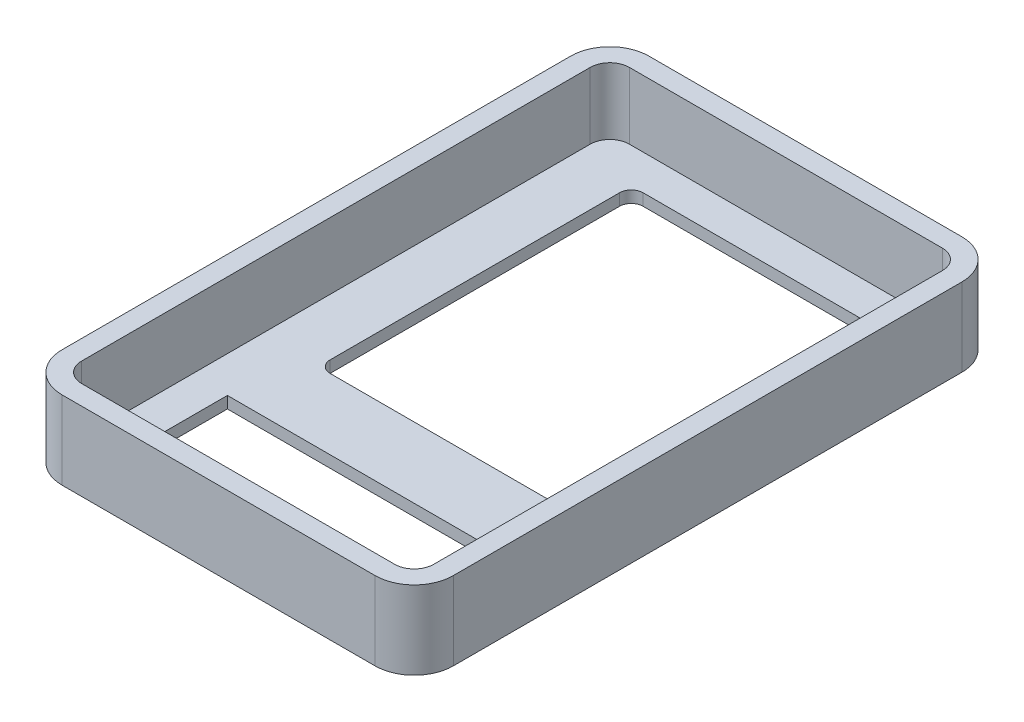
ISO-10303-21;
HEADER;
FILE_DESCRIPTION(('STEP AP214'),'2;1');
FILE_NAME('part.step','',(''),(''),'','','');
FILE_SCHEMA(('AUTOMOTIVE_DESIGN { 1 0 10303 214 1 1 1 1 }'));
ENDSEC;
DATA;
#1=APPLICATION_CONTEXT('core data for automotive mechanical design processes');
#2=APPLICATION_PROTOCOL_DEFINITION('international standard','automotive_design',2000,#1);
#3=PRODUCT_CONTEXT('',#1,'mechanical');
#4=PRODUCT('Part','Part','',(#3));
#5=PRODUCT_RELATED_PRODUCT_CATEGORY('part','',(#4));
#6=PRODUCT_DEFINITION_FORMATION('','',#4);
#7=PRODUCT_DEFINITION_CONTEXT('part definition',#1,'design');
#8=PRODUCT_DEFINITION('design','',#6,#7);
#9=PRODUCT_DEFINITION_SHAPE('','',#8);
#10=(LENGTH_UNIT() NAMED_UNIT(*) SI_UNIT(.MILLI.,.METRE.));
#11=(NAMED_UNIT(*) PLANE_ANGLE_UNIT() SI_UNIT($,.RADIAN.));
#12=(NAMED_UNIT(*) SI_UNIT($,.STERADIAN.) SOLID_ANGLE_UNIT());
#13=UNCERTAINTY_MEASURE_WITH_UNIT(LENGTH_MEASURE(1.E-05),#10,'distance_accuracy_value','');
#14=(GEOMETRIC_REPRESENTATION_CONTEXT(3) GLOBAL_UNCERTAINTY_ASSIGNED_CONTEXT((#13)) GLOBAL_UNIT_ASSIGNED_CONTEXT((#10,
#11,#12)) REPRESENTATION_CONTEXT('',''));
#15=CARTESIAN_POINT('',(0.,0.,0.));
#16=DIRECTION('',(0.,0.,1.));
#17=DIRECTION('',(1.,0.,0.));
#18=AXIS2_PLACEMENT_3D('',#15,#16,#17);
#19=CARTESIAN_POINT('',(-39.9999999999999,20.,-75.));
#20=DIRECTION('',(0.,0.,-1.));
#21=DIRECTION('',(-1.,0.,0.));
#22=AXIS2_PLACEMENT_3D('',#19,#20,#21);
#23=PLANE('',#22);
#24=DIRECTION('',(1.,0.,0.));
#25=VECTOR('',#24,1.);
#26=CARTESIAN_POINT('',(-39.9999999999999,0.,-75.));
#27=LINE('',#26,#25);
#28=CARTESIAN_POINT('',(-40.,0.,-75.));
#29=VERTEX_POINT('',#28);
#30=CARTESIAN_POINT('',(39.9999999999999,0.,-75.));
#31=VERTEX_POINT('',#30);
#32=EDGE_CURVE('E391',#29,#31,#27,.T.);
#33=ORIENTED_EDGE('',*,*,#32,.F.);
#34=DIRECTION('',(0.,-1.,0.));
#35=VECTOR('',#34,1.);
#36=CARTESIAN_POINT('',(-40.,20.,-75.));
#37=LINE('',#36,#35);
#38=CARTESIAN_POINT('',(-40.,20.,-75.));
#39=VERTEX_POINT('',#38);
#40=EDGE_CURVE('E471',#39,#29,#37,.T.);
#41=ORIENTED_EDGE('',*,*,#40,.F.);
#42=DIRECTION('',(1.,0.,0.));
#43=VECTOR('',#42,1.);
#44=CARTESIAN_POINT('',(-39.9999999999999,20.,-75.));
#45=LINE('',#44,#43);
#46=CARTESIAN_POINT('',(39.9999999999999,20.,-75.));
#47=VERTEX_POINT('',#46);
#48=EDGE_CURVE('E413',#39,#47,#45,.T.);
#49=ORIENTED_EDGE('',*,*,#48,.T.);
#50=DIRECTION('',(0.,-1.,0.));
#51=VECTOR('',#50,1.);
#52=CARTESIAN_POINT('',(39.9999999999999,20.,-75.));
#53=LINE('',#52,#51);
#54=EDGE_CURVE('E442',#47,#31,#53,.T.);
#55=ORIENTED_EDGE('',*,*,#54,.T.);
#56=EDGE_LOOP('',(#33,#41,#49,#55));
#57=FACE_BOUND('',#56,.T.);
#58=ADVANCED_FACE('F45',(#57),#23,.T.);
#59=CARTESIAN_POINT('',(-40.,20.,-65.));
#60=DIRECTION('',(0.,-1.,0.));
#61=DIRECTION('',(0.,0.,-1.));
#62=AXIS2_PLACEMENT_3D('',#59,#60,#61);
#63=CYLINDRICAL_SURFACE('',#62,9.99999999999999);
#64=CARTESIAN_POINT('',(-40.,0.,-65.));
#65=DIRECTION('',(0.,-1.,0.));
#66=DIRECTION('',(0.,0.,-1.));
#67=AXIS2_PLACEMENT_3D('',#64,#65,#66);
#68=CIRCLE('',#67,9.99999999999999);
#69=CARTESIAN_POINT('',(-50.,0.,-64.9999999999999));
#70=VERTEX_POINT('',#69);
#71=EDGE_CURVE('E418',#70,#29,#68,.T.);
#72=ORIENTED_EDGE('',*,*,#71,.F.);
#73=DIRECTION('',(0.,-1.,0.));
#74=VECTOR('',#73,1.);
#75=CARTESIAN_POINT('',(-50.,20.,-64.9999999999999));
#76=LINE('',#75,#74);
#77=CARTESIAN_POINT('',(-50.,20.,-64.9999999999999));
#78=VERTEX_POINT('',#77);
#79=EDGE_CURVE('E475',#78,#70,#76,.T.);
#80=ORIENTED_EDGE('',*,*,#79,.F.);
#81=CARTESIAN_POINT('',(-40.,20.,-65.));
#82=DIRECTION('',(0.,-1.,0.));
#83=DIRECTION('',(0.,0.,-1.));
#84=AXIS2_PLACEMENT_3D('',#81,#82,#83);
#85=CIRCLE('',#84,9.99999999999999);
#86=EDGE_CURVE('E438',#78,#39,#85,.T.);
#87=ORIENTED_EDGE('',*,*,#86,.T.);
#88=ORIENTED_EDGE('',*,*,#40,.T.);
#89=EDGE_LOOP('',(#72,#80,#87,#88));
#90=FACE_BOUND('',#89,.T.);
#91=ADVANCED_FACE('F569',(#90),#63,.T.);
#92=CARTESIAN_POINT('',(-50.,20.,64.9999999999999));
#93=DIRECTION('',(-1.,0.,0.));
#94=DIRECTION('',(0.,0.,1.));
#95=AXIS2_PLACEMENT_3D('',#92,#93,#94);
#96=PLANE('',#95);
#97=DIRECTION('',(0.,0.,-1.));
#98=VECTOR('',#97,1.);
#99=CARTESIAN_POINT('',(-50.,0.,64.9999999999999));
#100=LINE('',#99,#98);
#101=CARTESIAN_POINT('',(-50.,0.,64.9999999999999));
#102=VERTEX_POINT('',#101);
#103=EDGE_CURVE('E464',#102,#70,#100,.T.);
#104=ORIENTED_EDGE('',*,*,#103,.F.);
#105=DIRECTION('',(0.,-1.,0.));
#106=VECTOR('',#105,1.);
#107=CARTESIAN_POINT('',(-50.,20.,64.9999999999999));
#108=LINE('',#107,#106);
#109=CARTESIAN_POINT('',(-50.,20.,64.9999999999999));
#110=VERTEX_POINT('',#109);
#111=EDGE_CURVE('E478',#110,#102,#108,.T.);
#112=ORIENTED_EDGE('',*,*,#111,.F.);
#113=DIRECTION('',(0.,0.,-1.));
#114=VECTOR('',#113,1.);
#115=CARTESIAN_POINT('',(-50.,20.,64.9999999999999));
#116=LINE('',#115,#114);
#117=EDGE_CURVE('E434',#110,#78,#116,.T.);
#118=ORIENTED_EDGE('',*,*,#117,.T.);
#119=ORIENTED_EDGE('',*,*,#79,.T.);
#120=EDGE_LOOP('',(#104,#112,#118,#119));
#121=FACE_BOUND('',#120,.T.);
#122=ADVANCED_FACE('F574',(#121),#96,.T.);
#123=CARTESIAN_POINT('',(-40.,20.,65.));
#124=DIRECTION('',(0.,-1.,0.));
#125=DIRECTION('',(0.,0.,-1.));
#126=AXIS2_PLACEMENT_3D('',#123,#124,#125);
#127=CYLINDRICAL_SURFACE('',#126,9.99999999999999);
#128=CARTESIAN_POINT('',(-40.,0.,65.));
#129=DIRECTION('',(0.,1.,0.));
#130=DIRECTION('',(0.,0.,1.));
#131=AXIS2_PLACEMENT_3D('',#128,#129,#130);
#132=CIRCLE('',#131,9.99999999999999);
#133=CARTESIAN_POINT('',(-40.,0.,75.));
#134=VERTEX_POINT('',#133);
#135=EDGE_CURVE('E461',#102,#134,#132,.T.);
#136=ORIENTED_EDGE('',*,*,#135,.T.);
#137=DIRECTION('',(0.,-1.,0.));
#138=VECTOR('',#137,1.);
#139=CARTESIAN_POINT('',(-40.,20.,75.));
#140=LINE('',#139,#138);
#141=CARTESIAN_POINT('',(-40.,20.,75.));
#142=VERTEX_POINT('',#141);
#143=EDGE_CURVE('E481',#142,#134,#140,.T.);
#144=ORIENTED_EDGE('',*,*,#143,.F.);
#145=CARTESIAN_POINT('',(-40.,20.,65.));
#146=DIRECTION('',(0.,1.,0.));
#147=DIRECTION('',(0.,0.,1.));
#148=AXIS2_PLACEMENT_3D('',#145,#146,#147);
#149=CIRCLE('',#148,9.99999999999999);
#150=EDGE_CURVE('E431',#110,#142,#149,.T.);
#151=ORIENTED_EDGE('',*,*,#150,.F.);
#152=ORIENTED_EDGE('',*,*,#111,.T.);
#153=EDGE_LOOP('',(#136,#144,#151,#152));
#154=FACE_BOUND('',#153,.T.);
#155=ADVANCED_FACE('F609',(#154),#127,.T.);
#156=CARTESIAN_POINT('',(-39.9999999999999,20.,75.));
#157=DIRECTION('',(0.,0.,-1.));
#158=DIRECTION('',(-1.,0.,0.));
#159=AXIS2_PLACEMENT_3D('',#156,#157,#158);
#160=PLANE('',#159);
#161=DIRECTION('',(1.,0.,0.));
#162=VECTOR('',#161,1.);
#163=CARTESIAN_POINT('',(-39.9999999999999,0.,75.));
#164=LINE('',#163,#162);
#165=CARTESIAN_POINT('',(39.9999999999999,0.,75.));
#166=VERTEX_POINT('',#165);
#167=EDGE_CURVE('E457',#134,#166,#164,.T.);
#168=ORIENTED_EDGE('',*,*,#167,.T.);
#169=DIRECTION('',(0.,-1.,0.));
#170=VECTOR('',#169,1.);
#171=CARTESIAN_POINT('',(39.9999999999999,20.,75.));
#172=LINE('',#171,#170);
#173=CARTESIAN_POINT('',(39.9999999999999,20.,75.));
#174=VERTEX_POINT('',#173);
#175=EDGE_CURVE('E485',#174,#166,#172,.T.);
#176=ORIENTED_EDGE('',*,*,#175,.F.);
#177=DIRECTION('',(1.,0.,0.));
#178=VECTOR('',#177,1.);
#179=CARTESIAN_POINT('',(-39.9999999999999,20.,75.));
#180=LINE('',#179,#178);
#181=EDGE_CURVE('E428',#142,#174,#180,.T.);
#182=ORIENTED_EDGE('',*,*,#181,.F.);
#183=ORIENTED_EDGE('',*,*,#143,.T.);
#184=EDGE_LOOP('',(#168,#176,#182,#183));
#185=FACE_BOUND('',#184,.T.);
#186=ADVANCED_FACE('F604',(#185),#160,.F.);
#187=CARTESIAN_POINT('',(40.,20.,65.));
#188=DIRECTION('',(0.,-1.,0.));
#189=DIRECTION('',(0.,0.,-1.));
#190=AXIS2_PLACEMENT_3D('',#187,#188,#189);
#191=CYLINDRICAL_SURFACE('',#190,9.99999999999999);
#192=CARTESIAN_POINT('',(40.,0.,65.));
#193=DIRECTION('',(0.,-1.,0.));
#194=DIRECTION('',(0.,0.,-1.));
#195=AXIS2_PLACEMENT_3D('',#192,#193,#194);
#196=CIRCLE('',#195,9.99999999999999);
#197=CARTESIAN_POINT('',(50.,0.,64.9999999999999));
#198=VERTEX_POINT('',#197);
#199=EDGE_CURVE('E453',#198,#166,#196,.T.);
#200=ORIENTED_EDGE('',*,*,#199,.F.);
#201=DIRECTION('',(0.,-1.,0.));
#202=VECTOR('',#201,1.);
#203=CARTESIAN_POINT('',(50.,20.,64.9999999999999));
#204=LINE('',#203,#202);
#205=CARTESIAN_POINT('',(50.,20.,64.9999999999999));
#206=VERTEX_POINT('',#205);
#207=EDGE_CURVE('E488',#206,#198,#204,.T.);
#208=ORIENTED_EDGE('',*,*,#207,.F.);
#209=CARTESIAN_POINT('',(40.,20.,65.));
#210=DIRECTION('',(0.,-1.,0.));
#211=DIRECTION('',(0.,0.,-1.));
#212=AXIS2_PLACEMENT_3D('',#209,#210,#211);
#213=CIRCLE('',#212,9.99999999999999);
#214=EDGE_CURVE('E424',#206,#174,#213,.T.);
#215=ORIENTED_EDGE('',*,*,#214,.T.);
#216=ORIENTED_EDGE('',*,*,#175,.T.);
#217=EDGE_LOOP('',(#200,#208,#215,#216));
#218=FACE_BOUND('',#217,.T.);
#219=ADVANCED_FACE('F600',(#218),#191,.T.);
#220=CARTESIAN_POINT('',(50.,20.,64.9999999999999));
#221=DIRECTION('',(-1.,0.,0.));
#222=DIRECTION('',(0.,0.,1.));
#223=AXIS2_PLACEMENT_3D('',#220,#221,#222);
#224=PLANE('',#223);
#225=DIRECTION('',(0.,0.,-1.));
#226=VECTOR('',#225,1.);
#227=CARTESIAN_POINT('',(50.,0.,64.9999999999999));
#228=LINE('',#227,#226);
#229=CARTESIAN_POINT('',(50.,0.,-64.9999999999999));
#230=VERTEX_POINT('',#229);
#231=EDGE_CURVE('E450',#198,#230,#228,.T.);
#232=ORIENTED_EDGE('',*,*,#231,.T.);
#233=DIRECTION('',(0.,-1.,0.));
#234=VECTOR('',#233,1.);
#235=CARTESIAN_POINT('',(50.,20.,-64.9999999999999));
#236=LINE('',#235,#234);
#237=CARTESIAN_POINT('',(50.,20.,-64.9999999999999));
#238=VERTEX_POINT('',#237);
#239=EDGE_CURVE('E491',#238,#230,#236,.T.);
#240=ORIENTED_EDGE('',*,*,#239,.F.);
#241=DIRECTION('',(0.,0.,-1.));
#242=VECTOR('',#241,1.);
#243=CARTESIAN_POINT('',(50.,20.,64.9999999999999));
#244=LINE('',#243,#242);
#245=EDGE_CURVE('E421',#206,#238,#244,.T.);
#246=ORIENTED_EDGE('',*,*,#245,.F.);
#247=ORIENTED_EDGE('',*,*,#207,.T.);
#248=EDGE_LOOP('',(#232,#240,#246,#247));
#249=FACE_BOUND('',#248,.T.);
#250=ADVANCED_FACE('F621',(#249),#224,.F.);
#251=CARTESIAN_POINT('',(40.,20.,-65.));
#252=DIRECTION('',(0.,-1.,0.));
#253=DIRECTION('',(0.,0.,-1.));
#254=AXIS2_PLACEMENT_3D('',#251,#252,#253);
#255=CYLINDRICAL_SURFACE('',#254,9.99999999999999);
#256=CARTESIAN_POINT('',(40.,0.,-65.));
#257=DIRECTION('',(0.,1.,0.));
#258=DIRECTION('',(0.,0.,1.));
#259=AXIS2_PLACEMENT_3D('',#256,#257,#258);
#260=CIRCLE('',#259,9.99999999999999);
#261=EDGE_CURVE('E446',#230,#31,#260,.T.);
#262=ORIENTED_EDGE('',*,*,#261,.T.);
#263=ORIENTED_EDGE('',*,*,#54,.F.);
#264=CARTESIAN_POINT('',(40.,20.,-65.));
#265=DIRECTION('',(0.,1.,0.));
#266=DIRECTION('',(0.,0.,1.));
#267=AXIS2_PLACEMENT_3D('',#264,#265,#266);
#268=CIRCLE('',#267,9.99999999999999);
#269=EDGE_CURVE('E417',#238,#47,#268,.T.);
#270=ORIENTED_EDGE('',*,*,#269,.F.);
#271=ORIENTED_EDGE('',*,*,#239,.T.);
#272=EDGE_LOOP('',(#262,#263,#270,#271));
#273=FACE_BOUND('',#272,.T.);
#274=ADVANCED_FACE('F594',(#273),#255,.T.);
#275=CARTESIAN_POINT('',(40.,20.,-65.));
#276=DIRECTION('',(0.,1.,0.));
#277=DIRECTION('',(0.,0.,1.));
#278=AXIS2_PLACEMENT_3D('',#275,#276,#277);
#279=PLANE('',#278);
#280=CARTESIAN_POINT('',(40.,20.,-65.));
#281=DIRECTION('',(0.,1.,0.));
#282=DIRECTION('',(0.,0.,1.));
#283=AXIS2_PLACEMENT_3D('',#280,#281,#282);
#284=CIRCLE('',#283,4.99999999999999);
#285=CARTESIAN_POINT('',(45.,20.,-64.9999999999999));
#286=VERTEX_POINT('',#285);
#287=CARTESIAN_POINT('',(39.9999999999999,20.,-70.));
#288=VERTEX_POINT('',#287);
#289=EDGE_CURVE('E282',#286,#288,#284,.T.);
#290=ORIENTED_EDGE('',*,*,#289,.F.);
#291=DIRECTION('',(0.,0.,-1.));
#292=VECTOR('',#291,1.);
#293=CARTESIAN_POINT('',(45.,20.,65.));
#294=LINE('',#293,#292);
#295=CARTESIAN_POINT('',(45.,20.,65.));
#296=VERTEX_POINT('',#295);
#297=EDGE_CURVE('E330',#296,#286,#294,.T.);
#298=ORIENTED_EDGE('',*,*,#297,.F.);
#299=CARTESIAN_POINT('',(40.,20.,65.));
#300=DIRECTION('',(0.,1.,0.));
#301=DIRECTION('',(0.,0.,1.));
#302=AXIS2_PLACEMENT_3D('',#299,#300,#301);
#303=CIRCLE('',#302,4.99999999999999);
#304=CARTESIAN_POINT('',(39.9999999999999,20.,70.));
#305=VERTEX_POINT('',#304);
#306=EDGE_CURVE('E381',#305,#296,#303,.T.);
#307=ORIENTED_EDGE('',*,*,#306,.F.);
#308=DIRECTION('',(1.,0.,0.));
#309=VECTOR('',#308,1.);
#310=CARTESIAN_POINT('',(-40.,20.,70.));
#311=LINE('',#310,#309);
#312=CARTESIAN_POINT('',(-40.,20.,70.));
#313=VERTEX_POINT('',#312);
#314=EDGE_CURVE('E377',#313,#305,#311,.T.);
#315=ORIENTED_EDGE('',*,*,#314,.F.);
#316=CARTESIAN_POINT('',(-40.,20.,65.));
#317=DIRECTION('',(0.,1.,0.));
#318=DIRECTION('',(0.,0.,1.));
#319=AXIS2_PLACEMENT_3D('',#316,#317,#318);
#320=CIRCLE('',#319,4.99999999999999);
#321=CARTESIAN_POINT('',(-45.,20.,64.9999999999999));
#322=VERTEX_POINT('',#321);
#323=EDGE_CURVE('E373',#322,#313,#320,.T.);
#324=ORIENTED_EDGE('',*,*,#323,.F.);
#325=DIRECTION('',(0.,0.,1.));
#326=VECTOR('',#325,1.);
#327=CARTESIAN_POINT('',(-45.,20.,-64.9999999999999));
#328=LINE('',#327,#326);
#329=CARTESIAN_POINT('',(-45.,20.,-64.9999999999999));
#330=VERTEX_POINT('',#329);
#331=EDGE_CURVE('E369',#330,#322,#328,.T.);
#332=ORIENTED_EDGE('',*,*,#331,.F.);
#333=CARTESIAN_POINT('',(-40.,20.,-65.));
#334=DIRECTION('',(0.,1.,0.));
#335=DIRECTION('',(0.,0.,1.));
#336=AXIS2_PLACEMENT_3D('',#333,#334,#335);
#337=CIRCLE('',#336,4.99999999999999);
#338=CARTESIAN_POINT('',(-40.,20.,-70.));
#339=VERTEX_POINT('',#338);
#340=EDGE_CURVE('E365',#339,#330,#337,.T.);
#341=ORIENTED_EDGE('',*,*,#340,.F.);
#342=DIRECTION('',(-1.,0.,0.));
#343=VECTOR('',#342,1.);
#344=CARTESIAN_POINT('',(39.9999999999999,20.,-70.));
#345=LINE('',#344,#343);
#346=EDGE_CURVE('E361',#288,#339,#345,.T.);
#347=ORIENTED_EDGE('',*,*,#346,.F.);
#348=EDGE_LOOP('',(#290,#298,#307,#315,#324,#332,#341,#347));
#349=FACE_BOUND('',#348,.T.);
#350=ORIENTED_EDGE('',*,*,#48,.F.);
#351=ORIENTED_EDGE('',*,*,#86,.F.);
#352=ORIENTED_EDGE('',*,*,#117,.F.);
#353=ORIENTED_EDGE('',*,*,#150,.T.);
#354=ORIENTED_EDGE('',*,*,#181,.T.);
#355=ORIENTED_EDGE('',*,*,#214,.F.);
#356=ORIENTED_EDGE('',*,*,#245,.T.);
#357=ORIENTED_EDGE('',*,*,#269,.T.);
#358=EDGE_LOOP('',(#350,#351,#352,#353,#354,#355,#356,#357));
#359=FACE_BOUND('',#358,.T.);
#360=ADVANCED_FACE('F588',(#349,#359),#279,.T.);
#361=CARTESIAN_POINT('',(40.,0.,-65.));
#362=DIRECTION('',(0.,1.,0.));
#363=DIRECTION('',(0.,0.,1.));
#364=AXIS2_PLACEMENT_3D('',#361,#362,#363);
#365=PLANE('',#364);
#366=DIRECTION('',(-1.,0.,0.));
#367=VECTOR('',#366,1.);
#368=CARTESIAN_POINT('',(-27.5,0.,19.));
#369=LINE('',#368,#367);
#370=CARTESIAN_POINT('',(27.5,0.,19.));
#371=VERTEX_POINT('',#370);
#372=CARTESIAN_POINT('',(-27.5,0.,19.));
#373=VERTEX_POINT('',#372);
#374=EDGE_CURVE('E247',#371,#373,#369,.T.);
#375=ORIENTED_EDGE('',*,*,#374,.F.);
#376=CARTESIAN_POINT('',(27.5,0.,16.));
#377=DIRECTION('',(0.,-1.,0.));
#378=DIRECTION('',(0.,0.,1.));
#379=AXIS2_PLACEMENT_3D('',#376,#377,#378);
#380=CIRCLE('',#379,3.);
#381=CARTESIAN_POINT('',(30.5,0.,16.));
#382=VERTEX_POINT('',#381);
#383=EDGE_CURVE('E60',#382,#371,#380,.T.);
#384=ORIENTED_EDGE('',*,*,#383,.F.);
#385=DIRECTION('',(0.,0.,1.));
#386=VECTOR('',#385,1.);
#387=CARTESIAN_POINT('',(30.5,0.,-58.));
#388=LINE('',#387,#386);
#389=CARTESIAN_POINT('',(30.5,0.,-58.));
#390=VERTEX_POINT('',#389);
#391=EDGE_CURVE('E275',#390,#382,#388,.T.);
#392=ORIENTED_EDGE('',*,*,#391,.F.);
#393=CARTESIAN_POINT('',(27.5,0.,-58.));
#394=DIRECTION('',(0.,-1.,0.));
#395=DIRECTION('',(0.,0.,-1.));
#396=AXIS2_PLACEMENT_3D('',#393,#394,#395);
#397=CIRCLE('',#396,3.);
#398=CARTESIAN_POINT('',(27.5,0.,-61.));
#399=VERTEX_POINT('',#398);
#400=EDGE_CURVE('E271',#399,#390,#397,.T.);
#401=ORIENTED_EDGE('',*,*,#400,.F.);
#402=DIRECTION('',(1.,0.,0.));
#403=VECTOR('',#402,1.);
#404=CARTESIAN_POINT('',(-27.5,0.,-61.));
#405=LINE('',#404,#403);
#406=CARTESIAN_POINT('',(-27.5,0.,-61.));
#407=VERTEX_POINT('',#406);
#408=EDGE_CURVE('E267',#407,#399,#405,.T.);
#409=ORIENTED_EDGE('',*,*,#408,.F.);
#410=CARTESIAN_POINT('',(-27.5,0.,-58.));
#411=DIRECTION('',(0.,-1.,0.));
#412=DIRECTION('',(0.,0.,1.));
#413=AXIS2_PLACEMENT_3D('',#410,#411,#412);
#414=CIRCLE('',#413,3.);
#415=CARTESIAN_POINT('',(-30.5,0.,-58.));
#416=VERTEX_POINT('',#415);
#417=EDGE_CURVE('E260',#416,#407,#414,.T.);
#418=ORIENTED_EDGE('',*,*,#417,.F.);
#419=DIRECTION('',(0.,0.,-1.));
#420=VECTOR('',#419,1.);
#421=CARTESIAN_POINT('',(-30.5,0.,-58.));
#422=LINE('',#421,#420);
#423=CARTESIAN_POINT('',(-30.5,0.,16.));
#424=VERTEX_POINT('',#423);
#425=EDGE_CURVE('E256',#424,#416,#422,.T.);
#426=ORIENTED_EDGE('',*,*,#425,.F.);
#427=CARTESIAN_POINT('',(-27.5,0.,16.));
#428=DIRECTION('',(0.,-1.,0.));
#429=DIRECTION('',(0.,0.,1.));
#430=AXIS2_PLACEMENT_3D('',#427,#428,#429);
#431=CIRCLE('',#430,3.);
#432=EDGE_CURVE('E236',#373,#424,#431,.T.);
#433=ORIENTED_EDGE('',*,*,#432,.F.);
#434=EDGE_LOOP('',(#375,#384,#392,#401,#409,#418,#426,#433));
#435=FACE_BOUND('',#434,.T.);
#436=DIRECTION('',(1.,0.,0.));
#437=VECTOR('',#436,1.);
#438=CARTESIAN_POINT('',(-35.75,0.,37.));
#439=LINE('',#438,#437);
#440=CARTESIAN_POINT('',(-35.75,0.,37.));
#441=VERTEX_POINT('',#440);
#442=CARTESIAN_POINT('',(35.75,0.,37.));
#443=VERTEX_POINT('',#442);
#444=EDGE_CURVE('E319',#441,#443,#439,.T.);
#445=ORIENTED_EDGE('',*,*,#444,.F.);
#446=DIRECTION('',(0.,0.,-1.));
#447=VECTOR('',#446,1.);
#448=CARTESIAN_POINT('',(-35.75,0.,63.25));
#449=LINE('',#448,#447);
#450=CARTESIAN_POINT('',(-35.75,0.,63.25));
#451=VERTEX_POINT('',#450);
#452=EDGE_CURVE('E68',#451,#441,#449,.T.);
#453=ORIENTED_EDGE('',*,*,#452,.F.);
#454=DIRECTION('',(-1.,0.,0.));
#455=VECTOR('',#454,1.);
#456=CARTESIAN_POINT('',(-35.75,0.,63.25));
#457=LINE('',#456,#455);
#458=CARTESIAN_POINT('',(35.75,0.,63.25));
#459=VERTEX_POINT('',#458);
#460=EDGE_CURVE('E302',#459,#451,#457,.T.);
#461=ORIENTED_EDGE('',*,*,#460,.F.);
#462=DIRECTION('',(0.,0.,1.));
#463=VECTOR('',#462,1.);
#464=CARTESIAN_POINT('',(35.75,0.,63.25));
#465=LINE('',#464,#463);
#466=EDGE_CURVE('E315',#443,#459,#465,.T.);
#467=ORIENTED_EDGE('',*,*,#466,.F.);
#468=EDGE_LOOP('',(#445,#453,#461,#467));
#469=FACE_BOUND('',#468,.T.);
#470=ORIENTED_EDGE('',*,*,#32,.T.);
#471=ORIENTED_EDGE('',*,*,#261,.F.);
#472=ORIENTED_EDGE('',*,*,#231,.F.);
#473=ORIENTED_EDGE('',*,*,#199,.T.);
#474=ORIENTED_EDGE('',*,*,#167,.F.);
#475=ORIENTED_EDGE('',*,*,#135,.F.);
#476=ORIENTED_EDGE('',*,*,#103,.T.);
#477=ORIENTED_EDGE('',*,*,#71,.T.);
#478=EDGE_LOOP('',(#470,#471,#472,#473,#474,#475,#476,#477));
#479=FACE_BOUND('',#478,.T.);
#480=ADVANCED_FACE('F252',(#435,#469,#479),#365,.F.);
#481=CARTESIAN_POINT('',(40.,3.,-65.));
#482=DIRECTION('',(0.,1.,0.));
#483=DIRECTION('',(0.,0.,1.));
#484=AXIS2_PLACEMENT_3D('',#481,#482,#483);
#485=CYLINDRICAL_SURFACE('',#484,4.99999999999999);
#486=ORIENTED_EDGE('',*,*,#289,.T.);
#487=DIRECTION('',(0.,1.,0.));
#488=VECTOR('',#487,1.);
#489=CARTESIAN_POINT('',(39.9999999999999,3.,-70.));
#490=LINE('',#489,#488);
#491=CARTESIAN_POINT('',(39.9999999999999,3.,-70.));
#492=VERTEX_POINT('',#491);
#493=EDGE_CURVE('E358',#492,#288,#490,.T.);
#494=ORIENTED_EDGE('',*,*,#493,.F.);
#495=CARTESIAN_POINT('',(40.,3.,-65.));
#496=DIRECTION('',(0.,1.,0.));
#497=DIRECTION('',(0.,0.,1.));
#498=AXIS2_PLACEMENT_3D('',#495,#496,#497);
#499=CIRCLE('',#498,4.99999999999999);
#500=CARTESIAN_POINT('',(45.,3.,-64.9999999999999));
#501=VERTEX_POINT('',#500);
#502=EDGE_CURVE('E325',#501,#492,#499,.T.);
#503=ORIENTED_EDGE('',*,*,#502,.F.);
#504=DIRECTION('',(0.,1.,0.));
#505=VECTOR('',#504,1.);
#506=CARTESIAN_POINT('',(45.,3.,-64.9999999999999));
#507=LINE('',#506,#505);
#508=EDGE_CURVE('E388',#501,#286,#507,.T.);
#509=ORIENTED_EDGE('',*,*,#508,.T.);
#510=EDGE_LOOP('',(#486,#494,#503,#509));
#511=FACE_BOUND('',#510,.T.);
#512=ADVANCED_FACE('F633',(#511),#485,.F.);
#513=CARTESIAN_POINT('',(45.,3.,65.));
#514=DIRECTION('',(1.,0.,0.));
#515=DIRECTION('',(0.,0.,-1.));
#516=AXIS2_PLACEMENT_3D('',#513,#514,#515);
#517=PLANE('',#516);
#518=ORIENTED_EDGE('',*,*,#297,.T.);
#519=ORIENTED_EDGE('',*,*,#508,.F.);
#520=DIRECTION('',(0.,0.,-1.));
#521=VECTOR('',#520,1.);
#522=CARTESIAN_POINT('',(45.,3.,65.));
#523=LINE('',#522,#521);
#524=CARTESIAN_POINT('',(45.,3.,65.));
#525=VERTEX_POINT('',#524);
#526=EDGE_CURVE('E354',#525,#501,#523,.T.);
#527=ORIENTED_EDGE('',*,*,#526,.F.);
#528=DIRECTION('',(0.,1.,0.));
#529=VECTOR('',#528,1.);
#530=CARTESIAN_POINT('',(45.,3.,65.));
#531=LINE('',#530,#529);
#532=EDGE_CURVE('E392',#525,#296,#531,.T.);
#533=ORIENTED_EDGE('',*,*,#532,.T.);
#534=EDGE_LOOP('',(#518,#519,#527,#533));
#535=FACE_BOUND('',#534,.T.);
#536=ADVANCED_FACE('F638',(#535),#517,.F.);
#537=CARTESIAN_POINT('',(40.,3.,65.));
#538=DIRECTION('',(0.,1.,0.));
#539=DIRECTION('',(0.,0.,1.));
#540=AXIS2_PLACEMENT_3D('',#537,#538,#539);
#541=CYLINDRICAL_SURFACE('',#540,4.99999999999999);
#542=ORIENTED_EDGE('',*,*,#306,.T.);
#543=ORIENTED_EDGE('',*,*,#532,.F.);
#544=CARTESIAN_POINT('',(40.,3.,65.));
#545=DIRECTION('',(0.,1.,0.));
#546=DIRECTION('',(0.,0.,1.));
#547=AXIS2_PLACEMENT_3D('',#544,#545,#546);
#548=CIRCLE('',#547,4.99999999999999);
#549=CARTESIAN_POINT('',(39.9999999999999,3.,70.));
#550=VERTEX_POINT('',#549);
#551=EDGE_CURVE('E350',#550,#525,#548,.T.);
#552=ORIENTED_EDGE('',*,*,#551,.F.);
#553=DIRECTION('',(0.,1.,0.));
#554=VECTOR('',#553,1.);
#555=CARTESIAN_POINT('',(39.9999999999999,3.,70.));
#556=LINE('',#555,#554);
#557=EDGE_CURVE('E395',#550,#305,#556,.T.);
#558=ORIENTED_EDGE('',*,*,#557,.T.);
#559=EDGE_LOOP('',(#542,#543,#552,#558));
#560=FACE_BOUND('',#559,.T.);
#561=ADVANCED_FACE('F659',(#560),#541,.F.);
#562=CARTESIAN_POINT('',(-40.,3.,70.));
#563=DIRECTION('',(0.,0.,1.));
#564=DIRECTION('',(1.,0.,0.));
#565=AXIS2_PLACEMENT_3D('',#562,#563,#564);
#566=PLANE('',#565);
#567=ORIENTED_EDGE('',*,*,#314,.T.);
#568=ORIENTED_EDGE('',*,*,#557,.F.);
#569=DIRECTION('',(1.,0.,0.));
#570=VECTOR('',#569,1.);
#571=CARTESIAN_POINT('',(-40.,3.,70.));
#572=LINE('',#571,#570);
#573=CARTESIAN_POINT('',(-40.,3.,70.));
#574=VERTEX_POINT('',#573);
#575=EDGE_CURVE('E346',#574,#550,#572,.T.);
#576=ORIENTED_EDGE('',*,*,#575,.F.);
#577=DIRECTION('',(0.,1.,0.));
#578=VECTOR('',#577,1.);
#579=CARTESIAN_POINT('',(-40.,3.,70.));
#580=LINE('',#579,#578);
#581=EDGE_CURVE('E398',#574,#313,#580,.T.);
#582=ORIENTED_EDGE('',*,*,#581,.T.);
#583=EDGE_LOOP('',(#567,#568,#576,#582));
#584=FACE_BOUND('',#583,.T.);
#585=ADVANCED_FACE('F655',(#584),#566,.F.);
#586=CARTESIAN_POINT('',(-40.,3.,65.));
#587=DIRECTION('',(0.,1.,0.));
#588=DIRECTION('',(0.,0.,1.));
#589=AXIS2_PLACEMENT_3D('',#586,#587,#588);
#590=CYLINDRICAL_SURFACE('',#589,4.99999999999999);
#591=ORIENTED_EDGE('',*,*,#323,.T.);
#592=ORIENTED_EDGE('',*,*,#581,.F.);
#593=CARTESIAN_POINT('',(-40.,3.,65.));
#594=DIRECTION('',(0.,1.,0.));
#595=DIRECTION('',(0.,0.,1.));
#596=AXIS2_PLACEMENT_3D('',#593,#594,#595);
#597=CIRCLE('',#596,4.99999999999999);
#598=CARTESIAN_POINT('',(-45.,3.,64.9999999999999));
#599=VERTEX_POINT('',#598);
#600=EDGE_CURVE('E342',#599,#574,#597,.T.);
#601=ORIENTED_EDGE('',*,*,#600,.F.);
#602=DIRECTION('',(0.,1.,0.));
#603=VECTOR('',#602,1.);
#604=CARTESIAN_POINT('',(-45.,3.,64.9999999999999));
#605=LINE('',#604,#603);
#606=EDGE_CURVE('E401',#599,#322,#605,.T.);
#607=ORIENTED_EDGE('',*,*,#606,.T.);
#608=EDGE_LOOP('',(#591,#592,#601,#607));
#609=FACE_BOUND('',#608,.T.);
#610=ADVANCED_FACE('F651',(#609),#590,.F.);
#611=CARTESIAN_POINT('',(-45.,3.,-64.9999999999999));
#612=DIRECTION('',(-1.,0.,0.));
#613=DIRECTION('',(0.,0.,1.));
#614=AXIS2_PLACEMENT_3D('',#611,#612,#613);
#615=PLANE('',#614);
#616=ORIENTED_EDGE('',*,*,#331,.T.);
#617=ORIENTED_EDGE('',*,*,#606,.F.);
#618=DIRECTION('',(0.,0.,1.));
#619=VECTOR('',#618,1.);
#620=CARTESIAN_POINT('',(-45.,3.,-64.9999999999999));
#621=LINE('',#620,#619);
#622=CARTESIAN_POINT('',(-45.,3.,-64.9999999999999));
#623=VERTEX_POINT('',#622);
#624=EDGE_CURVE('E338',#623,#599,#621,.T.);
#625=ORIENTED_EDGE('',*,*,#624,.F.);
#626=DIRECTION('',(0.,1.,0.));
#627=VECTOR('',#626,1.);
#628=CARTESIAN_POINT('',(-45.,3.,-64.9999999999999));
#629=LINE('',#628,#627);
#630=EDGE_CURVE('E404',#623,#330,#629,.T.);
#631=ORIENTED_EDGE('',*,*,#630,.T.);
#632=EDGE_LOOP('',(#616,#617,#625,#631));
#633=FACE_BOUND('',#632,.T.);
#634=ADVANCED_FACE('F647',(#633),#615,.F.);
#635=CARTESIAN_POINT('',(-40.,3.,-65.));
#636=DIRECTION('',(0.,1.,0.));
#637=DIRECTION('',(0.,0.,1.));
#638=AXIS2_PLACEMENT_3D('',#635,#636,#637);
#639=CYLINDRICAL_SURFACE('',#638,4.99999999999999);
#640=ORIENTED_EDGE('',*,*,#340,.T.);
#641=ORIENTED_EDGE('',*,*,#630,.F.);
#642=CARTESIAN_POINT('',(-40.,3.,-65.));
#643=DIRECTION('',(0.,1.,0.));
#644=DIRECTION('',(0.,0.,1.));
#645=AXIS2_PLACEMENT_3D('',#642,#643,#644);
#646=CIRCLE('',#645,4.99999999999999);
#647=CARTESIAN_POINT('',(-40.,3.,-70.));
#648=VERTEX_POINT('',#647);
#649=EDGE_CURVE('E334',#648,#623,#646,.T.);
#650=ORIENTED_EDGE('',*,*,#649,.F.);
#651=DIRECTION('',(0.,1.,0.));
#652=VECTOR('',#651,1.);
#653=CARTESIAN_POINT('',(-40.,3.,-70.));
#654=LINE('',#653,#652);
#655=EDGE_CURVE('E407',#648,#339,#654,.T.);
#656=ORIENTED_EDGE('',*,*,#655,.T.);
#657=EDGE_LOOP('',(#640,#641,#650,#656));
#658=FACE_BOUND('',#657,.T.);
#659=ADVANCED_FACE('F643',(#658),#639,.F.);
#660=CARTESIAN_POINT('',(39.9999999999999,3.,-70.));
#661=DIRECTION('',(0.,0.,-1.));
#662=DIRECTION('',(-1.,0.,0.));
#663=AXIS2_PLACEMENT_3D('',#660,#661,#662);
#664=PLANE('',#663);
#665=ORIENTED_EDGE('',*,*,#346,.T.);
#666=ORIENTED_EDGE('',*,*,#655,.F.);
#667=DIRECTION('',(-1.,0.,0.));
#668=VECTOR('',#667,1.);
#669=CARTESIAN_POINT('',(39.9999999999999,3.,-70.));
#670=LINE('',#669,#668);
#671=EDGE_CURVE('E329',#492,#648,#670,.T.);
#672=ORIENTED_EDGE('',*,*,#671,.F.);
#673=ORIENTED_EDGE('',*,*,#493,.T.);
#674=EDGE_LOOP('',(#665,#666,#672,#673));
#675=FACE_BOUND('',#674,.T.);
#676=ADVANCED_FACE('F640',(#675),#664,.F.);
#677=CARTESIAN_POINT('',(40.,3.,-65.));
#678=DIRECTION('',(0.,1.,0.));
#679=DIRECTION('',(0.,0.,1.));
#680=AXIS2_PLACEMENT_3D('',#677,#678,#679);
#681=PLANE('',#680);
#682=CARTESIAN_POINT('',(27.5,3.,16.));
#683=DIRECTION('',(0.,1.,0.));
#684=DIRECTION('',(0.,0.,1.));
#685=AXIS2_PLACEMENT_3D('',#682,#683,#684);
#686=CIRCLE('',#685,3.);
#687=CARTESIAN_POINT('',(27.5,3.,19.));
#688=VERTEX_POINT('',#687);
#689=CARTESIAN_POINT('',(30.5,3.,16.));
#690=VERTEX_POINT('',#689);
#691=EDGE_CURVE('E11',#688,#690,#686,.T.);
#692=ORIENTED_EDGE('',*,*,#691,.F.);
#693=DIRECTION('',(1.,0.,0.));
#694=VECTOR('',#693,1.);
#695=CARTESIAN_POINT('',(40.,3.,19.));
#696=LINE('',#695,#694);
#697=CARTESIAN_POINT('',(-27.5,3.,19.));
#698=VERTEX_POINT('',#697);
#699=EDGE_CURVE('E509',#698,#688,#696,.T.);
#700=ORIENTED_EDGE('',*,*,#699,.F.);
#701=CARTESIAN_POINT('',(-27.5,3.,16.));
#702=DIRECTION('',(0.,1.,0.));
#703=DIRECTION('',(0.,0.,1.));
#704=AXIS2_PLACEMENT_3D('',#701,#702,#703);
#705=CIRCLE('',#704,3.);
#706=CARTESIAN_POINT('',(-30.5,3.,16.));
#707=VERTEX_POINT('',#706);
#708=EDGE_CURVE('E239',#707,#698,#705,.T.);
#709=ORIENTED_EDGE('',*,*,#708,.F.);
#710=DIRECTION('',(0.,0.,1.));
#711=VECTOR('',#710,1.);
#712=CARTESIAN_POINT('',(-30.5,3.,-65.));
#713=LINE('',#712,#711);
#714=CARTESIAN_POINT('',(-30.5,3.,-58.));
#715=VERTEX_POINT('',#714);
#716=EDGE_CURVE('E514',#715,#707,#713,.T.);
#717=ORIENTED_EDGE('',*,*,#716,.F.);
#718=CARTESIAN_POINT('',(-27.5,3.,-58.));
#719=DIRECTION('',(0.,1.,0.));
#720=DIRECTION('',(0.,0.,1.));
#721=AXIS2_PLACEMENT_3D('',#718,#719,#720);
#722=CIRCLE('',#721,3.);
#723=CARTESIAN_POINT('',(-27.5,3.,-61.));
#724=VERTEX_POINT('',#723);
#725=EDGE_CURVE('E517',#724,#715,#722,.T.);
#726=ORIENTED_EDGE('',*,*,#725,.F.);
#727=DIRECTION('',(-1.,0.,0.));
#728=VECTOR('',#727,1.);
#729=CARTESIAN_POINT('',(40.,3.,-61.));
#730=LINE('',#729,#728);
#731=CARTESIAN_POINT('',(27.5,3.,-61.));
#732=VERTEX_POINT('',#731);
#733=EDGE_CURVE('E520',#732,#724,#730,.T.);
#734=ORIENTED_EDGE('',*,*,#733,.F.);
#735=CARTESIAN_POINT('',(27.5,3.,-58.));
#736=DIRECTION('',(0.,1.,0.));
#737=DIRECTION('',(0.,0.,1.));
#738=AXIS2_PLACEMENT_3D('',#735,#736,#737);
#739=CIRCLE('',#738,3.);
#740=CARTESIAN_POINT('',(30.5,3.,-58.));
#741=VERTEX_POINT('',#740);
#742=EDGE_CURVE('E523',#741,#732,#739,.T.);
#743=ORIENTED_EDGE('',*,*,#742,.F.);
#744=DIRECTION('',(0.,0.,-1.));
#745=VECTOR('',#744,1.);
#746=CARTESIAN_POINT('',(30.5,3.,-65.));
#747=LINE('',#746,#745);
#748=EDGE_CURVE('E53',#690,#741,#747,.T.);
#749=ORIENTED_EDGE('',*,*,#748,.F.);
#750=EDGE_LOOP('',(#692,#700,#709,#717,#726,#734,#743,#749));
#751=FACE_BOUND('',#750,.T.);
#752=DIRECTION('',(0.,0.,1.));
#753=VECTOR('',#752,1.);
#754=CARTESIAN_POINT('',(-35.75,3.,-65.));
#755=LINE('',#754,#753);
#756=CARTESIAN_POINT('',(-35.75,3.,37.));
#757=VERTEX_POINT('',#756);
#758=CARTESIAN_POINT('',(-35.75,3.,63.25));
#759=VERTEX_POINT('',#758);
#760=EDGE_CURVE('E506',#757,#759,#755,.T.);
#761=ORIENTED_EDGE('',*,*,#760,.F.);
#762=DIRECTION('',(-1.,0.,0.));
#763=VECTOR('',#762,1.);
#764=CARTESIAN_POINT('',(40.,3.,37.));
#765=LINE('',#764,#763);
#766=CARTESIAN_POINT('',(35.75,3.,37.));
#767=VERTEX_POINT('',#766);
#768=EDGE_CURVE('E474',#767,#757,#765,.T.);
#769=ORIENTED_EDGE('',*,*,#768,.F.);
#770=DIRECTION('',(0.,0.,-1.));
#771=VECTOR('',#770,1.);
#772=CARTESIAN_POINT('',(35.75,3.,-65.));
#773=LINE('',#772,#771);
#774=CARTESIAN_POINT('',(35.75,3.,63.25));
#775=VERTEX_POINT('',#774);
#776=EDGE_CURVE('E499',#775,#767,#773,.T.);
#777=ORIENTED_EDGE('',*,*,#776,.F.);
#778=DIRECTION('',(1.,0.,0.));
#779=VECTOR('',#778,1.);
#780=CARTESIAN_POINT('',(40.,3.,63.25));
#781=LINE('',#780,#779);
#782=EDGE_CURVE('E503',#759,#775,#781,.T.);
#783=ORIENTED_EDGE('',*,*,#782,.F.);
#784=EDGE_LOOP('',(#761,#769,#777,#783));
#785=FACE_BOUND('',#784,.T.);
#786=ORIENTED_EDGE('',*,*,#502,.T.);
#787=ORIENTED_EDGE('',*,*,#671,.T.);
#788=ORIENTED_EDGE('',*,*,#649,.T.);
#789=ORIENTED_EDGE('',*,*,#624,.T.);
#790=ORIENTED_EDGE('',*,*,#600,.T.);
#791=ORIENTED_EDGE('',*,*,#575,.T.);
#792=ORIENTED_EDGE('',*,*,#551,.T.);
#793=ORIENTED_EDGE('',*,*,#526,.T.);
#794=EDGE_LOOP('',(#786,#787,#788,#789,#790,#791,#792,#793));
#795=FACE_BOUND('',#794,.T.);
#796=ADVANCED_FACE('F540',(#751,#785,#795),#681,.T.);
#797=CARTESIAN_POINT('',(-35.75,20.,63.25));
#798=DIRECTION('',(-1.,0.,0.));
#799=DIRECTION('',(0.,0.,1.));
#800=AXIS2_PLACEMENT_3D('',#797,#798,#799);
#801=PLANE('',#800);
#802=ORIENTED_EDGE('',*,*,#760,.T.);
#803=DIRECTION('',(0.,-1.,0.));
#804=VECTOR('',#803,1.);
#805=CARTESIAN_POINT('',(-35.75,20.,63.25));
#806=LINE('',#805,#804);
#807=EDGE_CURVE('E309',#759,#451,#806,.T.);
#808=ORIENTED_EDGE('',*,*,#807,.T.);
#809=ORIENTED_EDGE('',*,*,#452,.T.);
#810=DIRECTION('',(0.,-1.,0.));
#811=VECTOR('',#810,1.);
#812=CARTESIAN_POINT('',(-35.75,20.,37.));
#813=LINE('',#812,#811);
#814=EDGE_CURVE('E299',#757,#441,#813,.T.);
#815=ORIENTED_EDGE('',*,*,#814,.F.);
#816=EDGE_LOOP('',(#802,#808,#809,#815));
#817=FACE_BOUND('',#816,.T.);
#818=ADVANCED_FACE('F669',(#817),#801,.F.);
#819=CARTESIAN_POINT('',(-35.75,20.,63.25));
#820=DIRECTION('',(0.,0.,1.));
#821=DIRECTION('',(1.,0.,0.));
#822=AXIS2_PLACEMENT_3D('',#819,#820,#821);
#823=PLANE('',#822);
#824=ORIENTED_EDGE('',*,*,#782,.T.);
#825=DIRECTION('',(0.,-1.,0.));
#826=VECTOR('',#825,1.);
#827=CARTESIAN_POINT('',(35.75,20.,63.25));
#828=LINE('',#827,#826);
#829=EDGE_CURVE('E306',#775,#459,#828,.T.);
#830=ORIENTED_EDGE('',*,*,#829,.T.);
#831=ORIENTED_EDGE('',*,*,#460,.T.);
#832=ORIENTED_EDGE('',*,*,#807,.F.);
#833=EDGE_LOOP('',(#824,#830,#831,#832));
#834=FACE_BOUND('',#833,.T.);
#835=ADVANCED_FACE('F670',(#834),#823,.F.);
#836=CARTESIAN_POINT('',(35.75,20.,63.25));
#837=DIRECTION('',(1.,0.,0.));
#838=DIRECTION('',(0.,0.,-1.));
#839=AXIS2_PLACEMENT_3D('',#836,#837,#838);
#840=PLANE('',#839);
#841=ORIENTED_EDGE('',*,*,#776,.T.);
#842=DIRECTION('',(0.,-1.,0.));
#843=VECTOR('',#842,1.);
#844=CARTESIAN_POINT('',(35.75,20.,37.));
#845=LINE('',#844,#843);
#846=EDGE_CURVE('E303',#767,#443,#845,.T.);
#847=ORIENTED_EDGE('',*,*,#846,.T.);
#848=ORIENTED_EDGE('',*,*,#466,.T.);
#849=ORIENTED_EDGE('',*,*,#829,.F.);
#850=EDGE_LOOP('',(#841,#847,#848,#849));
#851=FACE_BOUND('',#850,.T.);
#852=ADVANCED_FACE('F563',(#851),#840,.F.);
#853=CARTESIAN_POINT('',(-35.75,20.,37.));
#854=DIRECTION('',(0.,0.,-1.));
#855=DIRECTION('',(-1.,0.,0.));
#856=AXIS2_PLACEMENT_3D('',#853,#854,#855);
#857=PLANE('',#856);
#858=ORIENTED_EDGE('',*,*,#768,.T.);
#859=ORIENTED_EDGE('',*,*,#814,.T.);
#860=ORIENTED_EDGE('',*,*,#444,.T.);
#861=ORIENTED_EDGE('',*,*,#846,.F.);
#862=EDGE_LOOP('',(#858,#859,#860,#861));
#863=FACE_BOUND('',#862,.T.);
#864=ADVANCED_FACE('F556',(#863),#857,.F.);
#865=CARTESIAN_POINT('',(27.5,20.,16.));
#866=DIRECTION('',(0.,-1.,0.));
#867=DIRECTION('',(0.,0.,-1.));
#868=AXIS2_PLACEMENT_3D('',#865,#866,#867);
#869=CYLINDRICAL_SURFACE('',#868,3.);
#870=ORIENTED_EDGE('',*,*,#691,.T.);
#871=DIRECTION('',(0.,-1.,0.));
#872=VECTOR('',#871,1.);
#873=CARTESIAN_POINT('',(30.5,20.,16.));
#874=LINE('',#873,#872);
#875=EDGE_CURVE('E279',#690,#382,#874,.T.);
#876=ORIENTED_EDGE('',*,*,#875,.T.);
#877=ORIENTED_EDGE('',*,*,#383,.T.);
#878=DIRECTION('',(0.,-1.,0.));
#879=VECTOR('',#878,1.);
#880=CARTESIAN_POINT('',(27.5,20.,19.));
#881=LINE('',#880,#879);
#882=EDGE_CURVE('E244',#688,#371,#881,.T.);
#883=ORIENTED_EDGE('',*,*,#882,.F.);
#884=EDGE_LOOP('',(#870,#876,#877,#883));
#885=FACE_BOUND('',#884,.T.);
#886=ADVANCED_FACE('F554',(#885),#869,.F.);
#887=CARTESIAN_POINT('',(30.5,20.,-58.));
#888=DIRECTION('',(1.,0.,0.));
#889=DIRECTION('',(0.,0.,-1.));
#890=AXIS2_PLACEMENT_3D('',#887,#888,#889);
#891=PLANE('',#890);
#892=ORIENTED_EDGE('',*,*,#748,.T.);
#893=DIRECTION('',(0.,-1.,0.));
#894=VECTOR('',#893,1.);
#895=CARTESIAN_POINT('',(30.5,20.,-58.));
#896=LINE('',#895,#894);
#897=EDGE_CURVE('E283',#741,#390,#896,.T.);
#898=ORIENTED_EDGE('',*,*,#897,.T.);
#899=ORIENTED_EDGE('',*,*,#391,.T.);
#900=ORIENTED_EDGE('',*,*,#875,.F.);
#901=EDGE_LOOP('',(#892,#898,#899,#900));
#902=FACE_BOUND('',#901,.T.);
#903=ADVANCED_FACE('F530',(#902),#891,.F.);
#904=CARTESIAN_POINT('',(27.5,20.,-58.));
#905=DIRECTION('',(0.,-1.,0.));
#906=DIRECTION('',(0.,0.,-1.));
#907=AXIS2_PLACEMENT_3D('',#904,#905,#906);
#908=CYLINDRICAL_SURFACE('',#907,3.);
#909=ORIENTED_EDGE('',*,*,#742,.T.);
#910=DIRECTION('',(0.,-1.,0.));
#911=VECTOR('',#910,1.);
#912=CARTESIAN_POINT('',(27.5,20.,-61.));
#913=LINE('',#912,#911);
#914=EDGE_CURVE('E286',#732,#399,#913,.T.);
#915=ORIENTED_EDGE('',*,*,#914,.T.);
#916=ORIENTED_EDGE('',*,*,#400,.T.);
#917=ORIENTED_EDGE('',*,*,#897,.F.);
#918=EDGE_LOOP('',(#909,#915,#916,#917));
#919=FACE_BOUND('',#918,.T.);
#920=ADVANCED_FACE('F535',(#919),#908,.F.);
#921=CARTESIAN_POINT('',(-27.5,20.,-61.));
#922=DIRECTION('',(0.,0.,-1.));
#923=DIRECTION('',(-1.,0.,0.));
#924=AXIS2_PLACEMENT_3D('',#921,#922,#923);
#925=PLANE('',#924);
#926=ORIENTED_EDGE('',*,*,#733,.T.);
#927=DIRECTION('',(0.,-1.,0.));
#928=VECTOR('',#927,1.);
#929=CARTESIAN_POINT('',(-27.5,20.,-61.));
#930=LINE('',#929,#928);
#931=EDGE_CURVE('E289',#724,#407,#930,.T.);
#932=ORIENTED_EDGE('',*,*,#931,.T.);
#933=ORIENTED_EDGE('',*,*,#408,.T.);
#934=ORIENTED_EDGE('',*,*,#914,.F.);
#935=EDGE_LOOP('',(#926,#932,#933,#934));
#936=FACE_BOUND('',#935,.T.);
#937=ADVANCED_FACE('F546',(#936),#925,.F.);
#938=CARTESIAN_POINT('',(-27.5,20.,-58.));
#939=DIRECTION('',(0.,-1.,0.));
#940=DIRECTION('',(0.,0.,-1.));
#941=AXIS2_PLACEMENT_3D('',#938,#939,#940);
#942=CYLINDRICAL_SURFACE('',#941,3.);
#943=ORIENTED_EDGE('',*,*,#725,.T.);
#944=DIRECTION('',(0.,-1.,0.));
#945=VECTOR('',#944,1.);
#946=CARTESIAN_POINT('',(-30.5,20.,-58.));
#947=LINE('',#946,#945);
#948=EDGE_CURVE('E292',#715,#416,#947,.T.);
#949=ORIENTED_EDGE('',*,*,#948,.T.);
#950=ORIENTED_EDGE('',*,*,#417,.T.);
#951=ORIENTED_EDGE('',*,*,#931,.F.);
#952=EDGE_LOOP('',(#943,#949,#950,#951));
#953=FACE_BOUND('',#952,.T.);
#954=ADVANCED_FACE('F548',(#953),#942,.F.);
#955=CARTESIAN_POINT('',(-30.5,20.,-58.));
#956=DIRECTION('',(-1.,0.,0.));
#957=DIRECTION('',(0.,0.,1.));
#958=AXIS2_PLACEMENT_3D('',#955,#956,#957);
#959=PLANE('',#958);
#960=ORIENTED_EDGE('',*,*,#716,.T.);
#961=DIRECTION('',(0.,-1.,0.));
#962=VECTOR('',#961,1.);
#963=CARTESIAN_POINT('',(-30.5,20.,16.));
#964=LINE('',#963,#962);
#965=EDGE_CURVE('E243',#707,#424,#964,.T.);
#966=ORIENTED_EDGE('',*,*,#965,.T.);
#967=ORIENTED_EDGE('',*,*,#425,.T.);
#968=ORIENTED_EDGE('',*,*,#948,.F.);
#969=EDGE_LOOP('',(#960,#966,#967,#968));
#970=FACE_BOUND('',#969,.T.);
#971=ADVANCED_FACE('F553',(#970),#959,.F.);
#972=CARTESIAN_POINT('',(-27.5,20.,16.));
#973=DIRECTION('',(0.,-1.,0.));
#974=DIRECTION('',(0.,0.,-1.));
#975=AXIS2_PLACEMENT_3D('',#972,#973,#974);
#976=CYLINDRICAL_SURFACE('',#975,3.);
#977=ORIENTED_EDGE('',*,*,#708,.T.);
#978=DIRECTION('',(0.,-1.,0.));
#979=VECTOR('',#978,1.);
#980=CARTESIAN_POINT('',(-27.5,20.,19.));
#981=LINE('',#980,#979);
#982=EDGE_CURVE('E231',#698,#373,#981,.T.);
#983=ORIENTED_EDGE('',*,*,#982,.T.);
#984=ORIENTED_EDGE('',*,*,#432,.T.);
#985=ORIENTED_EDGE('',*,*,#965,.F.);
#986=EDGE_LOOP('',(#977,#983,#984,#985));
#987=FACE_BOUND('',#986,.T.);
#988=ADVANCED_FACE('F233',(#987),#976,.F.);
#989=CARTESIAN_POINT('',(-27.5,20.,19.));
#990=DIRECTION('',(0.,0.,1.));
#991=DIRECTION('',(1.,0.,0.));
#992=AXIS2_PLACEMENT_3D('',#989,#990,#991);
#993=PLANE('',#992);
#994=ORIENTED_EDGE('',*,*,#699,.T.);
#995=ORIENTED_EDGE('',*,*,#882,.T.);
#996=ORIENTED_EDGE('',*,*,#374,.T.);
#997=ORIENTED_EDGE('',*,*,#982,.F.);
#998=EDGE_LOOP('',(#994,#995,#996,#997));
#999=FACE_BOUND('',#998,.T.);
#1000=ADVANCED_FACE('F248',(#999),#993,.F.);
#1001=CLOSED_SHELL('',(#58,#91,#122,#155,#186,#219,#250,#274,#360,#480,#512,#536,#561,#585,#610,
#634,#659,#676,#796,#818,#835,#852,#864,#886,#903,#920,#937,#954,#971,#988,#1000));
#1002=MANIFOLD_SOLID_BREP('B2',#1001);
#1003=ADVANCED_BREP_SHAPE_REPRESENTATION('',(#18,#1002),#14);
#1004=SHAPE_DEFINITION_REPRESENTATION(#9,#1003);
ENDSEC;
END-ISO-10303-21;
